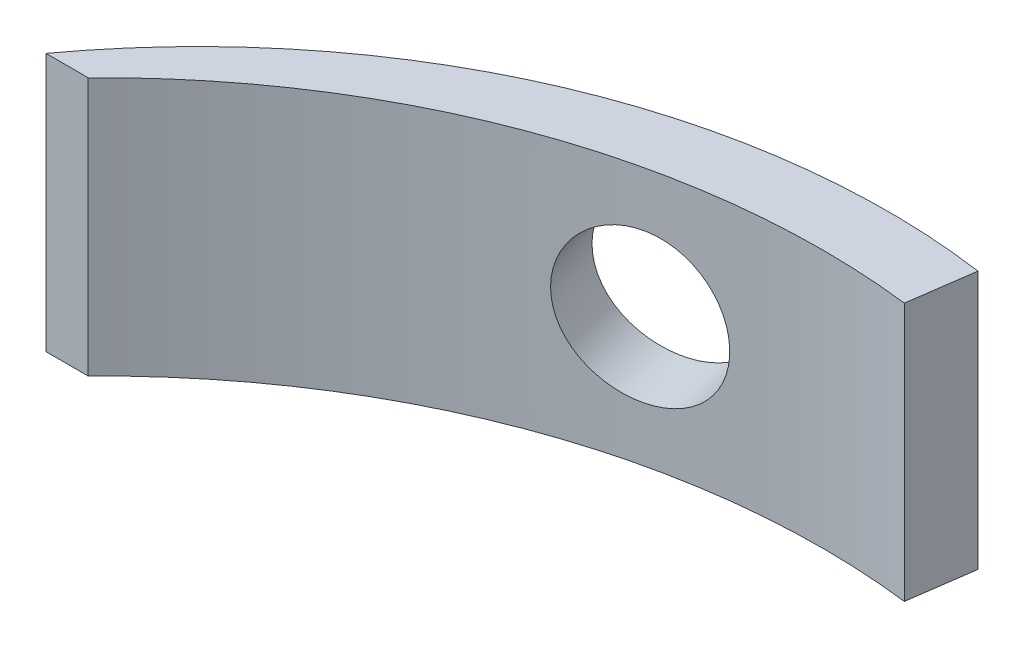
ISO-10303-21;
HEADER;
FILE_DESCRIPTION(('STEP AP214'),'2;1');
FILE_NAME('part.step','',(''),(''),'','','');
FILE_SCHEMA(('AUTOMOTIVE_DESIGN { 1 0 10303 214 1 1 1 1 }'));
ENDSEC;
DATA;
#1=APPLICATION_CONTEXT('core data for automotive mechanical design processes');
#2=APPLICATION_PROTOCOL_DEFINITION('international standard','automotive_design',2000,#1);
#3=PRODUCT_CONTEXT('',#1,'mechanical');
#4=PRODUCT('Part','Part','',(#3));
#5=PRODUCT_RELATED_PRODUCT_CATEGORY('part','',(#4));
#6=PRODUCT_DEFINITION_FORMATION('','',#4);
#7=PRODUCT_DEFINITION_CONTEXT('part definition',#1,'design');
#8=PRODUCT_DEFINITION('design','',#6,#7);
#9=PRODUCT_DEFINITION_SHAPE('','',#8);
#10=(LENGTH_UNIT() NAMED_UNIT(*) SI_UNIT(.MILLI.,.METRE.));
#11=(NAMED_UNIT(*) PLANE_ANGLE_UNIT() SI_UNIT($,.RADIAN.));
#12=(NAMED_UNIT(*) SI_UNIT($,.STERADIAN.) SOLID_ANGLE_UNIT());
#13=UNCERTAINTY_MEASURE_WITH_UNIT(LENGTH_MEASURE(1.E-05),#10,'distance_accuracy_value','');
#14=(GEOMETRIC_REPRESENTATION_CONTEXT(3) GLOBAL_UNCERTAINTY_ASSIGNED_CONTEXT((#13)) GLOBAL_UNIT_ASSIGNED_CONTEXT((#10,
#11,#12)) REPRESENTATION_CONTEXT('',''));
#15=CARTESIAN_POINT('',(0.,0.,0.));
#16=DIRECTION('',(0.,0.,1.));
#17=DIRECTION('',(1.,0.,0.));
#18=AXIS2_PLACEMENT_3D('',#15,#16,#17);
#19=CARTESIAN_POINT('',(146.569723697209,0.,20.5990313105062));
#20=DIRECTION('',(0.990268068741569,0.,0.139173100960076));
#21=DIRECTION('',(0.139173100960076,0.,-0.990268068741569));
#22=AXIS2_PLACEMENT_3D('',#19,#20,#21);
#23=PLANE('',#22);
#24=DIRECTION('',(0.,-1.,0.));
#25=VECTOR('',#24,1.);
#26=CARTESIAN_POINT('',(162.55301147089,57.15,-93.1279705784924));
#27=LINE('',#26,#25);
#28=CARTESIAN_POINT('',(162.55301147089,0.,-93.1279705784924));
#29=VERTEX_POINT('',#28);
#30=CARTESIAN_POINT('',(162.55301147089,57.15,-93.1279705784924));
#31=VERTEX_POINT('',#30);
#32=EDGE_CURVE('E90',#29,#31,#27,.F.);
#33=ORIENTED_EDGE('',*,*,#32,.T.);
#34=DIRECTION('',(-0.139173100960076,0.,0.990268068741569));
#35=VECTOR('',#34,1.);
#36=CARTESIAN_POINT('',(141.2875,57.15,58.1840058724832));
#37=LINE('',#36,#35);
#38=CARTESIAN_POINT('',(160.545112701114,57.15,-78.8410284664147));
#39=VERTEX_POINT('',#38);
#40=EDGE_CURVE('E79',#31,#39,#37,.T.);
#41=ORIENTED_EDGE('',*,*,#40,.T.);
#42=DIRECTION('',(0.,-1.,0.));
#43=VECTOR('',#42,1.);
#44=CARTESIAN_POINT('',(160.545112701114,57.15,-78.8410284664147));
#45=LINE('',#44,#43);
#46=CARTESIAN_POINT('',(160.545112701114,0.,-78.8410284664147));
#47=VERTEX_POINT('',#46);
#48=EDGE_CURVE('E85',#39,#47,#45,.T.);
#49=ORIENTED_EDGE('',*,*,#48,.T.);
#50=DIRECTION('',(-0.139173100960076,0.,0.990268068741569));
#51=VECTOR('',#50,1.);
#52=CARTESIAN_POINT('',(141.2875,0.,58.1840058724832));
#53=LINE('',#52,#51);
#54=EDGE_CURVE('E149',#29,#47,#53,.T.);
#55=ORIENTED_EDGE('',*,*,#54,.F.);
#56=EDGE_LOOP('',(#33,#41,#49,#55));
#57=FACE_BOUND('',#56,.T.);
#58=ADVANCED_FACE('F34',(#57),#23,.T.);
#59=CARTESIAN_POINT('',(139.154251524634,28.575,41.1252378473837));
#60=DIRECTION('',(-0.275637355816986,0.,-0.961261695938323));
#61=DIRECTION('',(-0.961261695938323,0.,0.275637355816986));
#62=AXIS2_PLACEMENT_3D('',#59,#60,#61);
#63=CYLINDRICAL_SURFACE('',#62,16.51);
#64=CARTESIAN_POINT('',(89.7063114149867,28.575,-71.4226810604363));
#65=CARTESIAN_POINT('',(89.7063071899196,29.038659604115,-71.4226787165995));
#66=CARTESIAN_POINT('',(89.7248188140627,29.5022481762504,-71.429022575401));
#67=CARTESIAN_POINT('',(89.7987456936112,30.4262801358477,-71.4543092254035));
#68=CARTESIAN_POINT('',(89.8541697078764,30.8867227506083,-71.4732550068856));
#69=CARTESIAN_POINT('',(90.0016383511833,31.801457795601,-71.5235139361024));
#70=CARTESIAN_POINT('',(90.0937186768308,32.2557437831636,-71.5548391389333));
#71=CARTESIAN_POINT('',(90.3139232938691,33.1545563675257,-71.629438045611));
#72=CARTESIAN_POINT('',(90.4420474544561,33.599082999736,-71.6727117060967));
#73=CARTESIAN_POINT('',(90.6605542577229,34.2559520032564,-71.7461154321919));
#74=CARTESIAN_POINT('',(90.7377701775766,34.4732397124487,-71.7719967327247));
#75=CARTESIAN_POINT('',(90.9008383230695,34.9041364681164,-71.8264989921598));
#76=CARTESIAN_POINT('',(90.9866883347208,35.1177464412806,-71.8551192486373));
#77=CARTESIAN_POINT('',(91.2570396689211,35.752613103266,-71.9449669658079));
#78=CARTESIAN_POINT('',(91.4543539738738,36.1679416534965,-72.0101853140129));
#79=CARTESIAN_POINT('',(91.8817175141064,36.9794933181517,-72.1503595743965));
#80=CARTESIAN_POINT('',(92.1117595806771,37.3757205911524,-72.2253133538081));
#81=CARTESIAN_POINT('',(92.6031348893398,38.1464332469907,-72.3840088843846));
#82=CARTESIAN_POINT('',(92.8644680412874,38.5209186924583,-72.4677506102328));
#83=CARTESIAN_POINT('',(93.4169574173246,39.2458085375131,-72.6430377350056));
#84=CARTESIAN_POINT('',(93.708140571141,39.5961907072116,-72.7345901677879));
#85=CARTESIAN_POINT('',(94.318212046769,40.2700160976674,-72.9242957112149));
#86=CARTESIAN_POINT('',(94.6371004118985,40.5934592763033,-73.0224488321799));
#87=CARTESIAN_POINT('',(95.3004696840664,41.2111106868926,-73.2241680364976));
#88=CARTESIAN_POINT('',(95.6449512839507,41.5053181268878,-73.3277342663684));
#89=CARTESIAN_POINT('',(96.3571878791883,42.0623884890863,-73.5390561816631));
#90=CARTESIAN_POINT('',(96.7249428358002,42.3252514634642,-73.646811860113));
#91=CARTESIAN_POINT('',(97.4808029340766,42.8174725875005,-73.8651580532482));
#92=CARTESIAN_POINT('',(97.868884393541,43.0468685988923,-73.9757451954461));
#93=CARTESIAN_POINT('',(98.6631303707827,43.4708748468469,-74.1986587131142));
#94=CARTESIAN_POINT('',(99.0692948769156,43.6654851058091,-74.3109850874645));
#95=CARTESIAN_POINT('',(99.896893012631,44.0185288733095,-74.5361939397528));
#96=CARTESIAN_POINT('',(100.318326269805,44.1769632634979,-74.6490764040697));
#97=CARTESIAN_POINT('',(101.173533383096,44.4565396265597,-74.874272640169));
#98=CARTESIAN_POINT('',(101.607307210613,44.5776816858532,-74.9865864132685));
#99=CARTESIAN_POINT('',(102.482784569729,44.7815118563462,-75.209242723182));
#100=CARTESIAN_POINT('',(102.924459305836,44.8643181697976,-75.3195902968739));
#101=CARTESIAN_POINT('',(103.813936256917,44.9914749426523,-75.5377103640666));
#102=CARTESIAN_POINT('',(104.261738456893,45.0358254961741,-75.6454828638691));
#103=CARTESIAN_POINT('',(105.160304111502,45.0857999365579,-75.8575912803879));
#104=CARTESIAN_POINT('',(105.611067550964,45.0914240216614,-75.9619272146932));
#105=CARTESIAN_POINT('',(106.512363969769,45.0639592465681,-76.1664111732569));
#106=CARTESIAN_POINT('',(106.962896948701,45.0308703177265,-76.2665591900891));
#107=CARTESIAN_POINT('',(107.86083849156,44.9262360071342,-76.4620965396994));
#108=CARTESIAN_POINT('',(108.308244734869,44.8546646168765,-76.5574826063934));
#109=CARTESIAN_POINT('',(109.196444323,44.6736122873159,-76.7429033976446));
#110=CARTESIAN_POINT('',(109.6372376691,44.5641313553318,-76.8329381232348));
#111=CARTESIAN_POINT('',(110.509095927584,44.3080779804101,-77.0072566804885));
#112=CARTESIAN_POINT('',(110.940160501967,44.1615042509313,-77.0915403125499));
#113=CARTESIAN_POINT('',(111.789485326352,43.8323353880588,-77.2540635865641));
#114=CARTESIAN_POINT('',(112.207745506752,43.6497400588979,-77.332303195666));
#115=CARTESIAN_POINT('',(113.031163210876,43.248524411003,-77.4830432423089));
#116=CARTESIAN_POINT('',(113.436217602429,43.0296771121692,-77.5555029627066));
#117=CARTESIAN_POINT('',(114.22741681676,42.558357437342,-77.6940209461451));
#118=CARTESIAN_POINT('',(114.613561557932,42.3058849162536,-77.760079181561));
#119=CARTESIAN_POINT('',(115.364151633863,41.7690687210615,-77.8857909427121));
#120=CARTESIAN_POINT('',(115.728596155686,41.4847238541002,-77.9454442285714));
#121=CARTESIAN_POINT('',(116.433102136892,40.8861381477964,-78.0584094677302));
#122=CARTESIAN_POINT('',(116.773163540377,40.5718972399217,-78.1117214064925));
#123=CARTESIAN_POINT('',(117.428044522696,39.9140147025058,-78.2123822733464));
#124=CARTESIAN_POINT('',(117.742727152115,39.5702318767882,-78.2596995459795));
#125=CARTESIAN_POINT('',(118.342528252118,38.857038805713,-78.3482204962368));
#126=CARTESIAN_POINT('',(118.627646591375,38.4876284465274,-78.3894241467041));
#127=CARTESIAN_POINT('',(119.166111978598,37.725763596636,-78.4659123818785));
#128=CARTESIAN_POINT('',(119.419459510589,37.3333094571334,-78.5011970567632));
#129=CARTESIAN_POINT('',(119.892393098875,36.5281100944904,-78.5660556243527));
#130=CARTESIAN_POINT('',(120.111979355033,36.1153649914883,-78.5956295508644));
#131=CARTESIAN_POINT('',(120.514693014299,35.2744648686754,-78.6491483005359));
#132=CARTESIAN_POINT('',(120.697984741853,34.8463901717063,-78.673118587815));
#133=CARTESIAN_POINT('',(121.027889296477,33.9760757561431,-78.7157940119509));
#134=CARTESIAN_POINT('',(121.174502199389,33.5338360668399,-78.7344991596944));
#135=CARTESIAN_POINT('',(121.429832333548,32.6383939664786,-78.7668060862324));
#136=CARTESIAN_POINT('',(121.538551871289,32.1851922244544,-78.7804081756434));
#137=CARTESIAN_POINT('',(121.71719743786,31.2710865277119,-78.802638089851));
#138=CARTESIAN_POINT('',(121.787123790664,30.8101826373495,-78.8112659561887));
#139=CARTESIAN_POINT('',(121.887043946371,29.8891024407133,-78.8235650495794));
#140=CARTESIAN_POINT('',(121.91746583487,29.4289732380797,-78.8272894190637));
#141=CARTESIAN_POINT('',(121.939530338611,28.5077738699563,-78.8299924257914));
#142=CARTESIAN_POINT('',(121.931173249721,28.0467037116724,-78.8289710992425));
#143=CARTESIAN_POINT('',(121.875750657762,27.1269461510898,-78.8221726811819));
#144=CARTESIAN_POINT('',(121.828686319816,26.6682586774884,-78.8163957328189));
#145=CARTESIAN_POINT('',(121.696241566194,25.7565373759346,-78.8000294278557));
#146=CARTESIAN_POINT('',(121.61086116382,25.3035035460195,-78.7894400729264));
#147=CARTESIAN_POINT('',(121.4029524404,24.408316047096,-78.7634067915481));
#148=CARTESIAN_POINT('',(121.280591207769,23.9661229164206,-78.7479846893133));
#149=CARTESIAN_POINT('',(120.999578474551,23.0936353359259,-78.7121351083741));
#150=CARTESIAN_POINT('',(120.840927130599,22.6633408347585,-78.6917076512738));
#151=CARTESIAN_POINT('',(120.488588546453,21.8176182225327,-78.6456805060738));
#152=CARTESIAN_POINT('',(120.294900264544,21.4021905539334,-78.6200806641866));
#153=CARTESIAN_POINT('',(119.874001224223,20.5890607851267,-78.5635225197689));
#154=CARTESIAN_POINT('',(119.646790213995,20.1913588181004,-78.5325641769861));
#155=CARTESIAN_POINT('',(119.158776792057,19.4134993785593,-78.464842221009));
#156=CARTESIAN_POINT('',(118.897737290963,19.0334942543325,-78.4280371751399));
#157=CARTESIAN_POINT('',(118.345389846129,18.2968099257255,-78.3485924419654));
#158=CARTESIAN_POINT('',(118.05408178193,17.9401308141842,-78.3059527314398));
#159=CARTESIAN_POINT('',(117.443361297671,17.2525018471912,-78.2146553775817));
#160=CARTESIAN_POINT('',(117.123947406214,16.9215533404985,-78.1659974191276));
#161=CARTESIAN_POINT('',(116.459379906294,16.2876470478833,-78.0625151117778));
#162=CARTESIAN_POINT('',(116.114226134099,15.9846894400388,-78.0076907236562));
#163=CARTESIAN_POINT('',(115.397000070638,15.4058475492211,-77.8911716802936));
#164=CARTESIAN_POINT('',(115.024686673619,15.130275040376,-77.8294119435911));
#165=CARTESIAN_POINT('',(114.259075901248,14.6117232677357,-77.6994442959552));
#166=CARTESIAN_POINT('',(113.865778373552,14.3687442406123,-77.6312363382053));
#167=CARTESIAN_POINT('',(113.061059913792,13.9170907344998,-77.4884019974778));
#168=CARTESIAN_POINT('',(112.649638740839,13.7084167116449,-77.4137755291769));
#169=CARTESIAN_POINT('',(111.811662533499,13.3268720765455,-77.2582260701814));
#170=CARTESIAN_POINT('',(111.385107521776,13.1540014106861,-77.1773030889159));
#171=CARTESIAN_POINT('',(110.519157586492,12.8450433003208,-77.0092299215843));
#172=CARTESIAN_POINT('',(110.079740607166,12.7090237056334,-76.922068617458));
#173=CARTESIAN_POINT('',(109.192003878342,12.4752087166955,-76.7419872211417));
#174=CARTESIAN_POINT('',(108.743684108029,12.3774134118325,-76.6490671154853));
#175=CARTESIAN_POINT('',(107.841412302467,12.220810698549,-76.4579280521717));
#176=CARTESIAN_POINT('',(107.387460433262,12.1620021435027,-76.3597092504446));
#177=CARTESIAN_POINT('',(106.477211436262,12.0838544286648,-76.1585508036466));
#178=CARTESIAN_POINT('',(106.020914322752,12.0645150287476,-76.0556111873005));
#179=CARTESIAN_POINT('',(105.112234488581,12.0655002665026,-75.8463927763697));
#180=CARTESIAN_POINT('',(104.659845524027,12.085569460168,-75.7401398512451));
#181=CARTESIAN_POINT('',(103.759259545024,12.1647706869709,-75.5244739943464));
#182=CARTESIAN_POINT('',(103.311062514336,12.2239025687167,-75.4150610748207));
#183=CARTESIAN_POINT('',(102.422066020781,12.3808433334144,-75.1939915771479));
#184=CARTESIAN_POINT('',(101.981266377912,12.4786512738319,-75.0823350537401));
#185=CARTESIAN_POINT('',(101.110178441359,12.7122706780319,-74.8577860077264));
#186=CARTESIAN_POINT('',(100.679890120824,12.8480820447294,-74.7448934882787));
#187=CARTESIAN_POINT('',(99.8350894951487,13.1559346977165,-74.5195614116892));
#188=CARTESIAN_POINT('',(99.4205059132604,13.3277809871943,-74.4071226085337));
#189=CARTESIAN_POINT('',(98.6075962441752,13.7069154933672,-74.1832416833952));
#190=CARTESIAN_POINT('',(98.2092700951236,13.9142035752012,-74.0717995576214));
#191=CARTESIAN_POINT('',(97.4316068982969,14.3627464849946,-73.8510985975457));
#192=CARTESIAN_POINT('',(97.0522692872559,14.6040003046021,-73.7418396985395));
#193=CARTESIAN_POINT('',(96.3151349492942,15.1187673936698,-73.5267104474449));
#194=CARTESIAN_POINT('',(95.9573382511266,15.392280706189,-73.4208400998797));
#195=CARTESIAN_POINT('',(95.2653917733409,15.9698721591995,-73.2136145700145));
#196=CARTESIAN_POINT('',(94.931261740173,16.2739753223286,-73.1122631836649));
#197=CARTESIAN_POINT('',(94.2892016833035,16.910389862769,-72.9153709492434));
#198=CARTESIAN_POINT('',(93.9812717548803,17.2427013426527,-72.8198301223025));
#199=CARTESIAN_POINT('',(93.3935281359456,17.9333315391205,-72.6356850253804));
#200=CARTESIAN_POINT('',(93.1137212887632,18.2916565493487,-72.5470824448703));
#201=CARTESIAN_POINT('',(92.7166398700467,18.8465403165439,-72.4202606464347));
#202=CARTESIAN_POINT('',(92.5880461226617,19.0344089087345,-72.378998844396));
#203=CARTESIAN_POINT('',(92.3385440443881,19.4156970711063,-72.29861148336));
#204=CARTESIAN_POINT('',(92.217637684431,19.6091180465332,-72.2594864725638));
#205=CARTESIAN_POINT('',(91.866043007346,20.1984189650452,-72.1452763429622));
#206=CARTESIAN_POINT('',(91.6472990465686,20.6021908855254,-72.0736187761173));
#207=CARTESIAN_POINT('',(91.2431823632006,21.4276352380156,-71.9404096086842));
#208=CARTESIAN_POINT('',(91.0578098165452,21.8493077643836,-71.8788580613753));
#209=CARTESIAN_POINT('',(90.7217688867153,22.7072171941898,-71.7667175352579));
#210=CARTESIAN_POINT('',(90.5710668202599,23.1434394862292,-71.7161179192146));
#211=CARTESIAN_POINT('',(90.3051651610423,24.0275758157306,-71.6264981557189));
#212=CARTESIAN_POINT('',(90.1899571144816,24.4754870415669,-71.5874752510623));
#213=CARTESIAN_POINT('',(89.9645096892288,25.5254760234187,-71.5109172160925));
#214=CARTESIAN_POINT('',(89.8677676145137,26.1308352329864,-71.4778911144308));
#215=CARTESIAN_POINT('',(89.7386712944239,27.3491709985078,-71.4337745940414));
#216=CARTESIAN_POINT('',(89.7063169995636,27.9621475486068,-71.422684158455));
#217=CARTESIAN_POINT('',(89.7063114149867,28.575,-71.4226810604363));
#218=B_SPLINE_CURVE_WITH_KNOTS('',3,(#64,#65,#66,#67,#68,#69,#70,#71,#72,#73,#74,#75,#76,#77,
#78,#79,#80,#81,#82,#83,#84,#85,#86,#87,#88,#89,#90,#91,#92,#93,#94,#95,#96,#97,#98,#99,#100,
#101,#102,#103,#104,#105,#106,#107,#108,#109,#110,#111,#112,#113,#114,#115,#116,#117,#118,#119,
#120,#121,#122,#123,#124,#125,#126,#127,#128,#129,#130,#131,#132,#133,#134,#135,#136,#137,#138,
#139,#140,#141,#142,#143,#144,#145,#146,#147,#148,#149,#150,#151,#152,#153,#154,#155,#156,#157,
#158,#159,#160,#161,#162,#163,#164,#165,#166,#167,#168,#169,#170,#171,#172,#173,#174,#175,#176,
#177,#178,#179,#180,#181,#182,#183,#184,#185,#186,#187,#188,#189,#190,#191,#192,#193,#194,#195,
#196,#197,#198,#199,#200,#201,#202,#203,#204,#205,#206,#207,#208,#209,#210,#211,#212,#213,#214,
#215,#216,#217),.UNSPECIFIED.,.T.,.F.,(4,2,2,2,2,2,2,2,2,2,2,2,2,2,2,2,2,2,2,2,2,2,2,2,2,2,2,2,
2,2,2,2,2,2,2,2,2,2,2,2,2,2,2,2,2,2,2,2,2,2,2,2,2,2,2,2,2,2,2,2,2,2,2,2,2,2,2,2,2,2,2,2,2,2,2,2,
4),(0.,1.39044577402833,2.78122160148523,4.17335511873377,5.56548358396499,6.26144860865133,
6.95723562406778,8.34869835221922,9.73985676142827,11.1310111630455,12.5234318536853,
13.9158547214471,15.3083152978561,16.7007735564068,18.0916440803586,19.4825137086958,
20.8733494362183,22.2641819406313,23.6506969918645,25.0372086496674,26.4237132098891,
27.8102202286234,29.1976655030592,30.5851105096355,31.9726036454953,33.3601043221879,
34.7566457036667,36.1531931115062,37.5497928041308,38.9463956983267,40.3500906674608,
41.7537918716795,43.1574716880683,44.5611431945802,45.9583064375981,47.3554667916967,
48.7525420886506,50.1496057180642,51.5314002943598,52.9131843281368,54.2949267704761,
55.6766687331018,57.0522586842144,58.4278426981001,59.8034676174389,61.1791028707187,
62.5649612989653,63.9508252426795,65.3367617823581,66.7227071387531,68.1229600964894,
69.5232232213713,70.9235049632605,72.3237846082347,73.7266251780217,75.129469028334,
76.5322716182629,77.9350656736799,79.3287969182665,80.7225227613252,82.1162146414211,
83.5099029611707,84.896235691464,86.2825631466832,87.66884945422,89.0551376121496,
90.44256912704,91.8300056871982,93.2177790459501,93.9117219379716,94.6058420350801,
95.9983686983342,97.390902702823,98.7820780564326,100.172921809839,102.010776021194,
103.848628820057),.UNSPECIFIED.);
#219=CARTESIAN_POINT('',(89.7063114149867,28.575,-71.4226810604363));
#220=VERTEX_POINT('',#219);
#221=EDGE_CURVE('E102',#220,#220,#218,.T.);
#222=ORIENTED_EDGE('',*,*,#221,.F.);
#223=EDGE_LOOP('',(#222));
#224=FACE_BOUND('',#223,.T.);
#225=CARTESIAN_POINT('',(86.0222558572413,28.575,-84.2705096244305));
#226=CARTESIAN_POINT('',(86.0222515503944,28.1120989758111,-84.2705069842389));
#227=CARTESIAN_POINT('',(86.04048623744,27.6492703304217,-84.2775858667872));
#228=CARTESIAN_POINT('',(86.1133049194062,26.7267608318967,-84.305804245029));
#229=CARTESIAN_POINT('',(86.1678974804124,26.2670807463676,-84.3269470542482));
#230=CARTESIAN_POINT('',(86.3131475939382,25.3538775854863,-84.3830408276301));
#231=CARTESIAN_POINT('',(86.4038399757346,24.9003608948781,-84.4180051266058));
#232=CARTESIAN_POINT('',(86.6207150127373,24.0030819733926,-84.5012852999568));
#233=CARTESIAN_POINT('',(86.7468975958275,23.5593197226962,-84.5496011472017));
#234=CARTESIAN_POINT('',(86.9620759404712,22.9036043290434,-84.631575652475));
#235=CARTESIAN_POINT('',(87.0381089355589,22.6867122787247,-84.6604799602388));
#236=CARTESIAN_POINT('',(87.1986747178071,22.2565992461378,-84.7213563460328));
#237=CARTESIAN_POINT('',(87.2832053217454,22.0433773373347,-84.7533276359919));
#238=CARTESIAN_POINT('',(87.5493953705119,21.4096595127873,-84.8537106403135));
#239=CARTESIAN_POINT('',(87.7436645114961,20.9950765828764,-84.9265958703674));
#240=CARTESIAN_POINT('',(88.1644218912166,20.1849414359681,-85.0833145893145));
#241=CARTESIAN_POINT('',(88.3909034685734,19.7893853068937,-85.1671458143346));
#242=CARTESIAN_POINT('',(88.8746713400905,19.0199124348961,-85.344729760026));
#243=CARTESIAN_POINT('',(89.1319575975992,18.645995666227,-85.4384824688925));
#244=CARTESIAN_POINT('',(89.6764049576062,17.921443116995,-85.6350298155276));
#245=CARTESIAN_POINT('',(89.9636460154305,17.5708739601232,-85.7378485332677));
#246=CARTESIAN_POINT('',(90.5655429967052,16.896604476723,-85.9510737509749));
#247=CARTESIAN_POINT('',(90.8801989929475,16.5729042215412,-86.061480271089));
#248=CARTESIAN_POINT('',(91.5348732798131,15.954646883853,-86.2885948106701));
#249=CARTESIAN_POINT('',(91.8748925562685,15.6600909351779,-86.4053030750276));
#250=CARTESIAN_POINT('',(92.5780359753195,15.1022243783186,-86.6436920631989));
#251=CARTESIAN_POINT('',(92.9411601075039,14.8389137560553,-86.765372784772));
#252=CARTESIAN_POINT('',(93.6884594525961,14.345172118452,-87.0124904276878));
#253=CARTESIAN_POINT('',(94.0726550037301,14.1147736714616,-87.1379309230865));
#254=CARTESIAN_POINT('',(94.8591751771982,13.6888203214894,-87.3911207903362));
#255=CARTESIAN_POINT('',(95.2614998192259,13.4932654563594,-87.5188701646952));
#256=CARTESIAN_POINT('',(96.0815159028412,13.1384181442859,-87.7753710943444));
#257=CARTESIAN_POINT('',(96.4992069619543,12.9791247954914,-87.9041226246278));
#258=CARTESIAN_POINT('',(97.347071698854,12.6979518765491,-88.1613773762201));
#259=CARTESIAN_POINT('',(97.7772453288849,12.5760721632853,-88.289880598477));
#260=CARTESIAN_POINT('',(98.6453007720827,12.3710277325129,-88.5449375765527));
#261=CARTESIAN_POINT('',(99.0831443870586,12.2877084742293,-88.6714971137697));
#262=CARTESIAN_POINT('',(99.9651455716714,12.1596576328693,-88.9221102213036));
#263=CARTESIAN_POINT('',(100.409303124548,12.1149259473793,-89.0461637982706));
#264=CARTESIAN_POINT('',(101.300773062489,12.0643633955629,-89.2907767042696));
#265=CARTESIAN_POINT('',(101.748085382196,12.058531725683,-89.4113361054293));
#266=CARTESIAN_POINT('',(102.642678773969,12.0857917194742,-89.6480883297807));
#267=CARTESIAN_POINT('',(103.089959846065,12.1188833464588,-89.764281157088));
#268=CARTESIAN_POINT('',(103.980041285758,12.2235817925819,-89.9912285040665));
#269=CARTESIAN_POINT('',(104.422850643132,12.2950814740132,-90.1019972206833));
#270=CARTESIAN_POINT('',(105.302071674156,12.4759884265698,-90.3178124895098));
#271=CARTESIAN_POINT('',(105.738483363205,12.5853956064305,-90.4228590554955));
#272=CARTESIAN_POINT('',(106.601785552511,12.8413127547695,-90.6267267489958));
#273=CARTESIAN_POINT('',(107.028675873753,12.987823420207,-90.725547759525));
#274=CARTESIAN_POINT('',(107.869860396199,13.3168828861597,-90.9165762954052));
#275=CARTESIAN_POINT('',(108.284154546397,13.4994318325837,-91.0087837939779));
#276=CARTESIAN_POINT('',(109.098659961975,13.8999963781927,-91.1866378145082));
#277=CARTESIAN_POINT('',(109.498813876352,14.1181398540815,-91.2722589790919));
#278=CARTESIAN_POINT('',(110.280523317159,14.5878610340486,-91.4363908782332));
#279=CARTESIAN_POINT('',(110.662078805175,14.8394388071813,-91.5149015981046));
#280=CARTESIAN_POINT('',(111.403823703038,15.3742660089472,-91.6647354601562));
#281=CARTESIAN_POINT('',(111.764012404391,15.6575164869086,-91.7360583640527));
#282=CARTESIAN_POINT('',(112.460372251684,16.2537052095002,-91.8715130164475));
#283=CARTESIAN_POINT('',(112.796543315286,16.5666435558976,-91.9356447402934));
#284=CARTESIAN_POINT('',(113.444155050499,17.2218259288622,-92.057112000611));
#285=CARTESIAN_POINT('',(113.755450283356,17.56422098973,-92.1144084153545));
#286=CARTESIAN_POINT('',(114.348904519545,18.2744338425496,-92.2219090308153));
#287=CARTESIAN_POINT('',(114.631063402939,18.6422517391431,-92.272113202338));
#288=CARTESIAN_POINT('',(115.164091376434,19.4007339156456,-92.3655771942467));
#289=CARTESIAN_POINT('',(115.414960496663,19.7913981735559,-92.4088370213193));
#290=CARTESIAN_POINT('',(115.883468234323,20.5928281852812,-92.4885790899051));
#291=CARTESIAN_POINT('',(116.10110694393,21.0035938833342,-92.5250613502182));
#292=CARTESIAN_POINT('',(116.501234032199,21.8418807727248,-92.5913844354674));
#293=CARTESIAN_POINT('',(116.683759494648,22.2693837066541,-92.6212322723852));
#294=CARTESIAN_POINT('',(117.012497044133,23.1385211732984,-92.6744979539591));
#295=CARTESIAN_POINT('',(117.158709129941,23.5801557064917,-92.6979157983975));
#296=CARTESIAN_POINT('',(117.413637575048,24.4743819955906,-92.7384628473561));
#297=CARTESIAN_POINT('',(117.522355407898,24.9269733201381,-92.7555922990164));
#298=CARTESIAN_POINT('',(117.701417567114,25.8398725247844,-92.783676560031));
#299=CARTESIAN_POINT('',(117.77176211262,26.3001803608004,-92.7946314046471));
#300=CARTESIAN_POINT('',(117.873148926086,27.2219813944591,-92.8103879850259));
#301=CARTESIAN_POINT('',(117.904459791969,27.6834443479569,-92.8152317748855));
#302=CARTESIAN_POINT('',(117.928414421067,28.6073957051582,-92.8189393520571));
#303=CARTESIAN_POINT('',(117.921058365552,29.0698841040443,-92.8178031674032));
#304=CARTESIAN_POINT('',(117.867739858575,29.9925662383112,-92.8095428431166));
#305=CARTESIAN_POINT('',(117.821778183052,30.4527600196249,-92.8024188238341));
#306=CARTESIAN_POINT('',(117.691622922896,31.3675733814978,-92.7821330765807));
#307=CARTESIAN_POINT('',(117.607429353549,31.8221929642858,-92.7689713510238));
#308=CARTESIAN_POINT('',(117.401815197561,32.7212013622425,-92.7365727038969));
#309=CARTESIAN_POINT('',(117.280512721367,33.165617895304,-92.7173550514113));
#310=CARTESIAN_POINT('',(117.001557003077,34.0425686973351,-92.672711252714));
#311=CARTESIAN_POINT('',(116.843903866996,34.4751030009546,-92.647285124609));
#312=CARTESIAN_POINT('',(116.493480465555,35.3252792790061,-92.5900777293418));
#313=CARTESIAN_POINT('',(116.300709355356,35.7429208948732,-92.5582963092875));
#314=CARTESIAN_POINT('',(115.881545290611,36.5604056815401,-92.4882171401426));
#315=CARTESIAN_POINT('',(115.655152159898,36.9602487590677,-92.4499193569085));
#316=CARTESIAN_POINT('',(115.169234308771,37.7413698714897,-92.3664290214586));
#317=CARTESIAN_POINT('',(114.909546318825,38.1225426874163,-92.3212022626046));
#318=CARTESIAN_POINT('',(114.359925166068,38.8614806243717,-92.2238389034061));
#319=CARTESIAN_POINT('',(114.069991915617,39.2192456775684,-92.1717022830391));
#320=CARTESIAN_POINT('',(113.462045786204,39.9089064311352,-92.0603809228614));
#321=CARTESIAN_POINT('',(113.144031936417,40.2408012363507,-92.0011959393442));
#322=CARTESIAN_POINT('',(112.482292712296,40.8764123829126,-91.8756809619608));
#323=CARTESIAN_POINT('',(112.138567247538,41.180128625152,-91.8093509429665));
#324=CARTESIAN_POINT('',(111.425753169535,41.7590426603478,-91.6690721452277));
#325=CARTESIAN_POINT('',(111.056522077413,42.0340543460987,-91.5950791820544));
#326=CARTESIAN_POINT('',(110.297318593785,42.5514719509362,-91.4398389733313));
#327=CARTESIAN_POINT('',(109.907346107994,42.793877721786,-91.3585916948039));
#328=CARTESIAN_POINT('',(109.10953164929,43.2443500706132,-91.1889529967007));
#329=CARTESIAN_POINT('',(108.701689756252,43.4524168020635,-91.1005616090569));
#330=CARTESIAN_POINT('',(107.87112826195,43.8327077629825,-90.9168431061636));
#331=CARTESIAN_POINT('',(107.448408703582,44.0049320957825,-90.8215160109103));
#332=CARTESIAN_POINT('',(106.591663591981,44.312106588331,-90.6243545050195));
#333=CARTESIAN_POINT('',(106.157651108863,44.4470979090886,-90.5225274347496));
#334=CARTESIAN_POINT('',(105.281038610272,44.6790579553443,-90.3127080133477));
#335=CARTESIAN_POINT('',(104.83843859505,44.7760266819536,-90.204715662396));
#336=CARTESIAN_POINT('',(103.947891918558,44.9312072562735,-89.9831308014225));
#337=CARTESIAN_POINT('',(103.499945419533,44.9894202770389,-89.8695384610127));
#338=CARTESIAN_POINT('',(102.601951777247,45.0666434476513,-89.6374391562937));
#339=CARTESIAN_POINT('',(102.151904643792,45.0856537803122,-89.5189322149053));
#340=CARTESIAN_POINT('',(101.255622296059,45.0843158381762,-89.2785282742703));
#341=CARTESIAN_POINT('',(100.809380253846,45.0641990193546,-89.1566553895938));
#342=CARTESIAN_POINT('',(99.9212181242704,44.9851964904633,-88.9097715875981));
#343=CARTESIAN_POINT('',(99.4792980197056,44.9263109347674,-88.784760682776));
#344=CARTESIAN_POINT('',(98.6029038744666,44.7701888079702,-88.5326236183705));
#345=CARTESIAN_POINT('',(98.1684297615141,44.6729526093589,-88.4054974793433));
#346=CARTESIAN_POINT('',(97.3099607018666,44.4408279408217,-88.1502443186604));
#347=CARTESIAN_POINT('',(96.8859657575858,44.3059394622215,-88.0221172967741));
#348=CARTESIAN_POINT('',(96.0521945281318,43.9997788624396,-87.7663046528457));
#349=CARTESIAN_POINT('',(95.6423923354863,43.8285775955516,-87.6386186563532));
#350=CARTESIAN_POINT('',(94.8389356751125,43.4508625614375,-87.3846878667199));
#351=CARTESIAN_POINT('',(94.4452811796894,43.2443488547785,-87.2584430711075));
#352=CARTESIAN_POINT('',(93.6767692825695,42.7974820316655,-87.0086860504469));
#353=CARTESIAN_POINT('',(93.3019116344182,42.5571293590477,-86.8851737895831));
#354=CARTESIAN_POINT('',(92.5734769888967,42.0442844773649,-86.6421920451495));
#355=CARTESIAN_POINT('',(92.2199000534585,41.7717921747727,-86.5227225733456));
#356=CARTESIAN_POINT('',(91.5350379418162,41.1954777659785,-86.2886911772884));
#357=CARTESIAN_POINT('',(91.2038433196589,40.8915396754598,-86.1741497991046));
#358=CARTESIAN_POINT('',(90.5674210452813,40.2553622515037,-85.9517754190756));
#359=CARTESIAN_POINT('',(90.2621935459035,39.9231227515072,-85.8439424567173));
#360=CARTESIAN_POINT('',(89.679586949993,39.232529995455,-85.6362124361887));
#361=CARTESIAN_POINT('',(89.4022146730583,38.8741703814763,-85.5363173226295));
#362=CARTESIAN_POINT('',(89.0085639826957,38.3191456282334,-85.3933897683242));
#363=CARTESIAN_POINT('',(88.8810770691854,38.1312153112829,-85.3468980532828));
#364=CARTESIAN_POINT('',(88.6337130113828,37.7497722730417,-85.2563380196463));
#365=CARTESIAN_POINT('',(88.5138378303408,37.5562581301152,-85.2122703266541));
#366=CARTESIAN_POINT('',(88.1652175090091,36.9666129917978,-85.0836487119391));
#367=CARTESIAN_POINT('',(87.9483006163582,36.5625398983186,-85.0029759071572));
#368=CARTESIAN_POINT('',(87.5475199191227,35.7363576403059,-84.85304017875));
#369=CARTESIAN_POINT('',(87.3636562156746,35.3142484205901,-84.7837772900368));
#370=CARTESIAN_POINT('',(87.0303142585464,34.4553371961438,-84.6576048504686));
#371=CARTESIAN_POINT('',(86.8808023231566,34.0185500689813,-84.6006832022125));
#372=CARTESIAN_POINT('',(86.6169663287249,33.1331667437494,-84.4998714203724));
#373=CARTESIAN_POINT('',(86.5026338146175,32.6845734113777,-84.4559781556205));
#374=CARTESIAN_POINT('',(86.2787642380704,31.6324306712226,-84.3698231964606));
#375=CARTESIAN_POINT('',(86.1826572670725,31.025551202057,-84.332649907396));
#376=CARTESIAN_POINT('',(86.0544060491956,29.8040719575773,-84.2829949177342));
#377=CARTESIAN_POINT('',(86.0222615743117,29.1894722097912,-84.2705131291201));
#378=CARTESIAN_POINT('',(86.0222558572413,28.575,-84.2705096244305));
#379=B_SPLINE_CURVE_WITH_KNOTS('',3,(#225,#226,#227,#228,#229,#230,#231,#232,#233,#234,#235,
#236,#237,#238,#239,#240,#241,#242,#243,#244,#245,#246,#247,#248,#249,#250,#251,#252,#253,#254,
#255,#256,#257,#258,#259,#260,#261,#262,#263,#264,#265,#266,#267,#268,#269,#270,#271,#272,#273,
#274,#275,#276,#277,#278,#279,#280,#281,#282,#283,#284,#285,#286,#287,#288,#289,#290,#291,#292,
#293,#294,#295,#296,#297,#298,#299,#300,#301,#302,#303,#304,#305,#306,#307,#308,#309,#310,#311,
#312,#313,#314,#315,#316,#317,#318,#319,#320,#321,#322,#323,#324,#325,#326,#327,#328,#329,#330,
#331,#332,#333,#334,#335,#336,#337,#338,#339,#340,#341,#342,#343,#344,#345,#346,#347,#348,#349,
#350,#351,#352,#353,#354,#355,#356,#357,#358,#359,#360,#361,#362,#363,#364,#365,#366,#367,#368,
#369,#370,#371,#372,#373,#374,#375,#376,#377,#378),.UNSPECIFIED.,.T.,.F.,(4,2,2,2,2,2,2,2,2,2,2,
2,2,2,2,2,2,2,2,2,2,2,2,2,2,2,2,2,2,2,2,2,2,2,2,2,2,2,2,2,2,2,2,2,2,2,2,2,2,2,2,2,2,2,2,2,2,2,2,
2,2,2,2,2,2,2,2,2,2,2,2,2,2,2,2,2,4),(0.,1.38816742471254,2.77666202393818,4.16649950900048,
5.55633416992986,6.25108705958049,6.94566190595473,8.33470092855645,9.7234531209747,
11.1122036610619,12.5047608341239,13.8973217048096,15.2899367304535,16.6825511285809,
18.0765341856914,19.4705187571287,20.8644686553397,22.2584132212942,23.646721763657,
25.0350266213562,26.4233028009001,27.8115776719439,29.1959999646066,30.5804189242169,
31.9648638909573,33.3493144630418,34.7388529799315,36.1283943667863,37.5179818032964,
38.9075740033524,40.3047724071122,41.7019765621543,43.0991793718557,44.4963783059007,
45.8920934309337,47.2878086031953,48.6834689165903,50.0791212595846,51.465115880955,
52.8511040048005,54.2370642721987,55.6230239854469,57.0046175610435,58.3862071073274,
59.7678298951308,61.149459922394,62.5381446414441,63.9268333845058,65.3155701572444,
66.7043118141291,68.1015611332715,69.4988168045322,70.896066230811,72.293311628859,
73.6890061271378,75.0847005846292,76.48035279543,77.8759984978746,79.2634133877522,
80.6508227530959,82.0382186432174,83.4256148529644,84.8103284475265,86.1950396670784,
87.5797327262769,88.9644298150735,90.3544297411837,91.7444378482732,93.1347854358668,
93.8300146865396,94.5254225313626,95.9205863098039,97.3157543571045,98.7095485562721,
100.103007507091,101.945719666043,103.788425256332),.UNSPECIFIED.);
#380=CARTESIAN_POINT('',(86.0222558572413,28.575,-84.2705096244305));
#381=VERTEX_POINT('',#380);
#382=EDGE_CURVE('E97',#381,#381,#379,.T.);
#383=ORIENTED_EDGE('',*,*,#382,.F.);
#384=EDGE_LOOP('',(#383));
#385=FACE_BOUND('',#384,.T.);
#386=ADVANCED_FACE('F122',(#224,#385),#63,.F.);
#387=CARTESIAN_POINT('',(0.,57.15,-31.75));
#388=DIRECTION('',(0.,0.,1.));
#389=DIRECTION('',(1.,0.,0.));
#390=AXIS2_PLACEMENT_3D('',#387,#388,#389);
#391=PLANE('',#390);
#392=DIRECTION('',(0.,-1.,0.));
#393=VECTOR('',#392,1.);
#394=CARTESIAN_POINT('',(17.7585123762551,57.15,-31.75));
#395=LINE('',#394,#393);
#396=CARTESIAN_POINT('',(17.7585123762551,57.15,-31.75));
#397=VERTEX_POINT('',#396);
#398=CARTESIAN_POINT('',(17.7585123762551,0.,-31.75));
#399=VERTEX_POINT('',#398);
#400=EDGE_CURVE('E107',#397,#399,#395,.T.);
#401=ORIENTED_EDGE('',*,*,#400,.T.);
#402=DIRECTION('',(-1.,0.,0.));
#403=VECTOR('',#402,1.);
#404=CARTESIAN_POINT('',(141.2875,0.,-31.75));
#405=LINE('',#404,#403);
#406=CARTESIAN_POINT('',(27.104102134048,0.,-31.75));
#407=VERTEX_POINT('',#406);
#408=EDGE_CURVE('E51',#407,#399,#405,.T.);
#409=ORIENTED_EDGE('',*,*,#408,.F.);
#410=DIRECTION('',(0.,-1.,0.));
#411=VECTOR('',#410,1.);
#412=CARTESIAN_POINT('',(27.104102134048,57.15,-31.75));
#413=LINE('',#412,#411);
#414=CARTESIAN_POINT('',(27.104102134048,57.15,-31.75));
#415=VERTEX_POINT('',#414);
#416=EDGE_CURVE('E43',#407,#415,#413,.F.);
#417=ORIENTED_EDGE('',*,*,#416,.T.);
#418=DIRECTION('',(-1.,0.,0.));
#419=VECTOR('',#418,1.);
#420=CARTESIAN_POINT('',(0.,57.15,-31.75));
#421=LINE('',#420,#419);
#422=EDGE_CURVE('E11',#415,#397,#421,.T.);
#423=ORIENTED_EDGE('',*,*,#422,.T.);
#424=EDGE_LOOP('',(#401,#409,#417,#423));
#425=FACE_BOUND('',#424,.T.);
#426=ADVANCED_FACE('F126',(#425),#391,.T.);
#427=CARTESIAN_POINT('',(141.2875,57.15,79.1992410714286));
#428=DIRECTION('',(0.,-1.,0.));
#429=DIRECTION('',(0.,0.,-1.));
#430=AXIS2_PLACEMENT_3D('',#427,#428,#429);
#431=CYLINDRICAL_SURFACE('',#430,159.209241071429);
#432=ORIENTED_EDGE('',*,*,#221,.T.);
#433=EDGE_LOOP('',(#432));
#434=FACE_BOUND('',#433,.T.);
#435=ORIENTED_EDGE('',*,*,#48,.F.);
#436=CARTESIAN_POINT('',(141.2875,57.15,79.1992410714286));
#437=DIRECTION('',(0.,-1.,0.));
#438=DIRECTION('',(0.,0.,-1.));
#439=AXIS2_PLACEMENT_3D('',#436,#437,#438);
#440=CIRCLE('',#439,159.209241071429);
#441=EDGE_CURVE('E75',#415,#39,#440,.T.);
#442=ORIENTED_EDGE('',*,*,#441,.F.);
#443=ORIENTED_EDGE('',*,*,#416,.F.);
#444=CARTESIAN_POINT('',(141.2875,0.,79.1992410714286));
#445=DIRECTION('',(0.,-1.,0.));
#446=DIRECTION('',(0.,0.,-1.));
#447=AXIS2_PLACEMENT_3D('',#444,#445,#446);
#448=CIRCLE('',#447,159.209241071429);
#449=EDGE_CURVE('E88',#407,#47,#448,.T.);
#450=ORIENTED_EDGE('',*,*,#449,.T.);
#451=EDGE_LOOP('',(#435,#442,#443,#450));
#452=FACE_BOUND('',#451,.T.);
#453=ADVANCED_FACE('F86',(#434,#452),#431,.F.);
#454=CARTESIAN_POINT('',(141.2875,57.15,58.1840058724832));
#455=DIRECTION('',(0.,-1.,0.));
#456=DIRECTION('',(0.,0.,-1.));
#457=AXIS2_PLACEMENT_3D('',#454,#455,#456);
#458=CYLINDRICAL_SURFACE('',#457,152.799005872483);
#459=ORIENTED_EDGE('',*,*,#382,.T.);
#460=EDGE_LOOP('',(#459));
#461=FACE_BOUND('',#460,.T.);
#462=ORIENTED_EDGE('',*,*,#32,.F.);
#463=CARTESIAN_POINT('',(141.2875,0.,58.1840058724832));
#464=DIRECTION('',(0.,1.,0.));
#465=DIRECTION('',(0.,0.,-1.));
#466=AXIS2_PLACEMENT_3D('',#463,#464,#465);
#467=CIRCLE('',#466,152.799005872483);
#468=EDGE_CURVE('E38',#29,#399,#467,.T.);
#469=ORIENTED_EDGE('',*,*,#468,.T.);
#470=ORIENTED_EDGE('',*,*,#400,.F.);
#471=CARTESIAN_POINT('',(141.2875,57.15,58.1840058724832));
#472=DIRECTION('',(0.,1.,0.));
#473=DIRECTION('',(0.,0.,-1.));
#474=AXIS2_PLACEMENT_3D('',#471,#472,#473);
#475=CIRCLE('',#474,152.799005872483);
#476=EDGE_CURVE('E81',#31,#397,#475,.T.);
#477=ORIENTED_EDGE('',*,*,#476,.F.);
#478=EDGE_LOOP('',(#462,#469,#470,#477));
#479=FACE_BOUND('',#478,.T.);
#480=ADVANCED_FACE('F119',(#461,#479),#458,.T.);
#481=CARTESIAN_POINT('',(141.2875,0.,58.1840058724832));
#482=DIRECTION('',(0.,-1.,0.));
#483=DIRECTION('',(0.,0.,-1.));
#484=AXIS2_PLACEMENT_3D('',#481,#482,#483);
#485=PLANE('',#484);
#486=ORIENTED_EDGE('',*,*,#468,.F.);
#487=ORIENTED_EDGE('',*,*,#54,.T.);
#488=ORIENTED_EDGE('',*,*,#449,.F.);
#489=ORIENTED_EDGE('',*,*,#408,.T.);
#490=EDGE_LOOP('',(#486,#487,#488,#489));
#491=FACE_BOUND('',#490,.T.);
#492=ADVANCED_FACE('F36',(#491),#485,.T.);
#493=CARTESIAN_POINT('',(141.2875,57.15,58.1840058724832));
#494=DIRECTION('',(0.,-1.,0.));
#495=DIRECTION('',(0.,0.,-1.));
#496=AXIS2_PLACEMENT_3D('',#493,#494,#495);
#497=PLANE('',#496);
#498=ORIENTED_EDGE('',*,*,#40,.F.);
#499=ORIENTED_EDGE('',*,*,#476,.T.);
#500=ORIENTED_EDGE('',*,*,#422,.F.);
#501=ORIENTED_EDGE('',*,*,#441,.T.);
#502=EDGE_LOOP('',(#498,#499,#500,#501));
#503=FACE_BOUND('',#502,.T.);
#504=ADVANCED_FACE('F77',(#503),#497,.F.);
#505=CLOSED_SHELL('',(#58,#386,#426,#453,#480,#492,#504));
#506=MANIFOLD_SOLID_BREP('B2',#505);
#507=ADVANCED_BREP_SHAPE_REPRESENTATION('',(#18,#506),#14);
#508=SHAPE_DEFINITION_REPRESENTATION(#9,#507);
ENDSEC;
END-ISO-10303-21;
